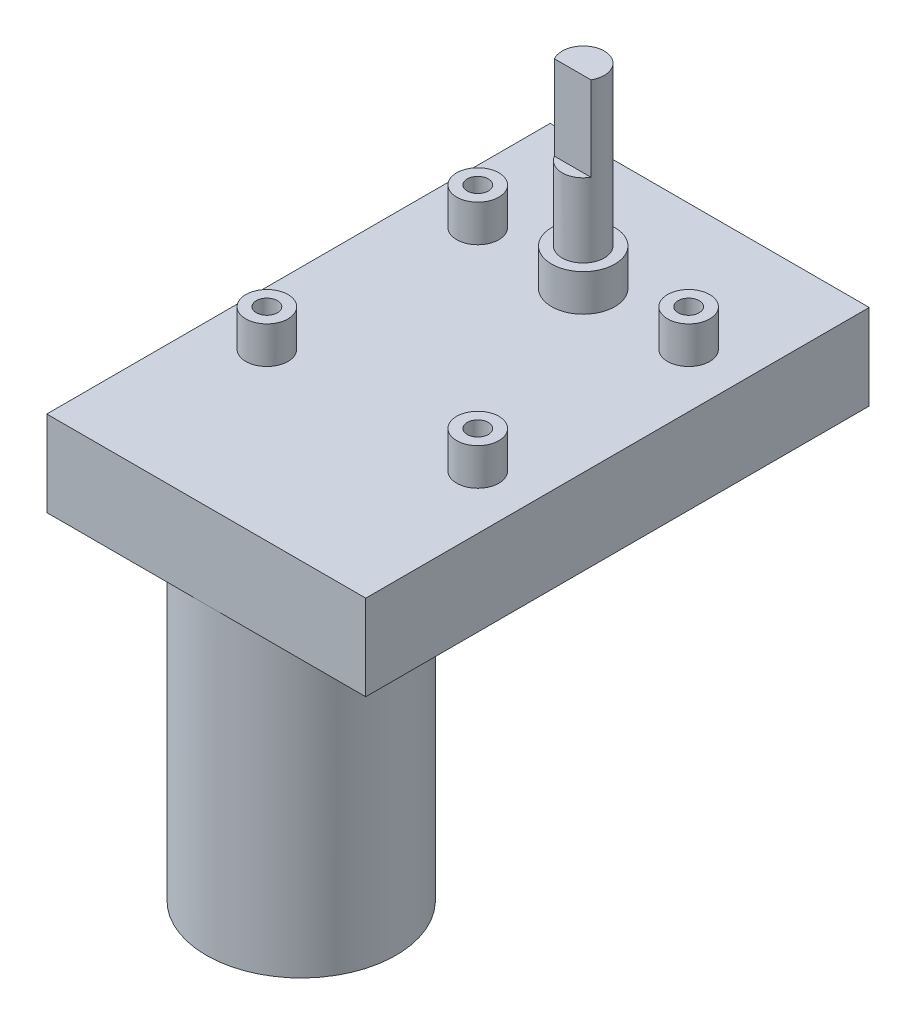
ISO-10303-21;
HEADER;
FILE_DESCRIPTION(('STEP AP214'),'2;1');
FILE_NAME('part.step','',(''),(''),'','','');
FILE_SCHEMA(('AUTOMOTIVE_DESIGN { 1 0 10303 214 1 1 1 1 }'));
ENDSEC;
DATA;
#1=APPLICATION_CONTEXT('core data for automotive mechanical design processes');
#2=APPLICATION_PROTOCOL_DEFINITION('international standard','automotive_design',2000,#1);
#3=PRODUCT_CONTEXT('',#1,'mechanical');
#4=PRODUCT('Part','Part','',(#3));
#5=PRODUCT_RELATED_PRODUCT_CATEGORY('part','',(#4));
#6=PRODUCT_DEFINITION_FORMATION('','',#4);
#7=PRODUCT_DEFINITION_CONTEXT('part definition',#1,'design');
#8=PRODUCT_DEFINITION('design','',#6,#7);
#9=PRODUCT_DEFINITION_SHAPE('','',#8);
#10=(LENGTH_UNIT() NAMED_UNIT(*) SI_UNIT(.MILLI.,.METRE.));
#11=(NAMED_UNIT(*) PLANE_ANGLE_UNIT() SI_UNIT($,.RADIAN.));
#12=(NAMED_UNIT(*) SI_UNIT($,.STERADIAN.) SOLID_ANGLE_UNIT());
#13=UNCERTAINTY_MEASURE_WITH_UNIT(LENGTH_MEASURE(1.E-05),#10,'distance_accuracy_value','');
#14=(GEOMETRIC_REPRESENTATION_CONTEXT(3) GLOBAL_UNCERTAINTY_ASSIGNED_CONTEXT((#13)) GLOBAL_UNIT_ASSIGNED_CONTEXT((#10,
#11,#12)) REPRESENTATION_CONTEXT('',''));
#15=CARTESIAN_POINT('',(0.,0.,0.));
#16=DIRECTION('',(0.,0.,1.));
#17=DIRECTION('',(1.,0.,0.));
#18=AXIS2_PLACEMENT_3D('',#15,#16,#17);
#19=CARTESIAN_POINT('',(-30.25,16.2,71.5));
#20=DIRECTION('',(-1.,0.,0.));
#21=DIRECTION('',(0.,0.,1.));
#22=AXIS2_PLACEMENT_3D('',#19,#20,#21);
#23=PLANE('',#22);
#24=DIRECTION('',(0.,0.,-1.));
#25=VECTOR('',#24,1.);
#26=CARTESIAN_POINT('',(-30.25,0.,71.5));
#27=LINE('',#26,#25);
#28=CARTESIAN_POINT('',(-30.25,0.,71.5));
#29=VERTEX_POINT('',#28);
#30=CARTESIAN_POINT('',(-30.25,0.,-24.));
#31=VERTEX_POINT('',#30);
#32=EDGE_CURVE('E178',#29,#31,#27,.T.);
#33=ORIENTED_EDGE('',*,*,#32,.F.);
#34=DIRECTION('',(0.,-1.,0.));
#35=VECTOR('',#34,1.);
#36=CARTESIAN_POINT('',(-30.25,16.2,71.5));
#37=LINE('',#36,#35);
#38=CARTESIAN_POINT('',(-30.25,16.2,71.5));
#39=VERTEX_POINT('',#38);
#40=EDGE_CURVE('E210',#39,#29,#37,.T.);
#41=ORIENTED_EDGE('',*,*,#40,.F.);
#42=DIRECTION('',(0.,0.,-1.));
#43=VECTOR('',#42,1.);
#44=CARTESIAN_POINT('',(-30.25,16.2,71.5));
#45=LINE('',#44,#43);
#46=CARTESIAN_POINT('',(-30.25,16.2,-24.));
#47=VERTEX_POINT('',#46);
#48=EDGE_CURVE('E179',#39,#47,#45,.T.);
#49=ORIENTED_EDGE('',*,*,#48,.T.);
#50=DIRECTION('',(0.,-1.,0.));
#51=VECTOR('',#50,1.);
#52=CARTESIAN_POINT('',(-30.25,16.2,-24.));
#53=LINE('',#52,#51);
#54=EDGE_CURVE('E194',#47,#31,#53,.T.);
#55=ORIENTED_EDGE('',*,*,#54,.T.);
#56=EDGE_LOOP('',(#33,#41,#49,#55));
#57=FACE_BOUND('',#56,.T.);
#58=ADVANCED_FACE('F39',(#57),#23,.T.);
#59=CARTESIAN_POINT('',(-30.25,16.2,71.5));
#60=DIRECTION('',(0.,0.,-1.));
#61=DIRECTION('',(-1.,0.,0.));
#62=AXIS2_PLACEMENT_3D('',#59,#60,#61);
#63=PLANE('',#62);
#64=DIRECTION('',(1.,0.,0.));
#65=VECTOR('',#64,1.);
#66=CARTESIAN_POINT('',(-30.25,0.,71.5));
#67=LINE('',#66,#65);
#68=CARTESIAN_POINT('',(0.,0.,71.5));
#69=VERTEX_POINT('',#68);
#70=EDGE_CURVE('E184',#29,#69,#67,.T.);
#71=ORIENTED_EDGE('',*,*,#70,.T.);
#72=CARTESIAN_POINT('',(30.25,0.,71.5));
#73=VERTEX_POINT('',#72);
#74=EDGE_CURVE('E206',#69,#73,#67,.T.);
#75=ORIENTED_EDGE('',*,*,#74,.T.);
#76=DIRECTION('',(0.,-1.,0.));
#77=VECTOR('',#76,1.);
#78=CARTESIAN_POINT('',(30.25,16.2,71.5));
#79=LINE('',#78,#77);
#80=CARTESIAN_POINT('',(30.25,16.2,71.5));
#81=VERTEX_POINT('',#80);
#82=EDGE_CURVE('E214',#81,#73,#79,.T.);
#83=ORIENTED_EDGE('',*,*,#82,.F.);
#84=DIRECTION('',(1.,0.,0.));
#85=VECTOR('',#84,1.);
#86=CARTESIAN_POINT('',(-30.25,16.2,71.5));
#87=LINE('',#86,#85);
#88=EDGE_CURVE('E191',#39,#81,#87,.T.);
#89=ORIENTED_EDGE('',*,*,#88,.F.);
#90=ORIENTED_EDGE('',*,*,#40,.T.);
#91=EDGE_LOOP('',(#71,#75,#83,#89,#90));
#92=FACE_BOUND('',#91,.T.);
#93=ADVANCED_FACE('F282',(#92),#63,.F.);
#94=CARTESIAN_POINT('',(30.25,16.2,71.5));
#95=DIRECTION('',(-1.,0.,0.));
#96=DIRECTION('',(0.,0.,1.));
#97=AXIS2_PLACEMENT_3D('',#94,#95,#96);
#98=PLANE('',#97);
#99=DIRECTION('',(0.,0.,-1.));
#100=VECTOR('',#99,1.);
#101=CARTESIAN_POINT('',(30.25,0.,71.5));
#102=LINE('',#101,#100);
#103=CARTESIAN_POINT('',(30.25,0.,-24.));
#104=VERTEX_POINT('',#103);
#105=EDGE_CURVE('E202',#73,#104,#102,.T.);
#106=ORIENTED_EDGE('',*,*,#105,.T.);
#107=DIRECTION('',(0.,-1.,0.));
#108=VECTOR('',#107,1.);
#109=CARTESIAN_POINT('',(30.25,16.2,-24.));
#110=LINE('',#109,#108);
#111=CARTESIAN_POINT('',(30.25,16.2,-24.));
#112=VERTEX_POINT('',#111);
#113=EDGE_CURVE('E218',#112,#104,#110,.T.);
#114=ORIENTED_EDGE('',*,*,#113,.F.);
#115=DIRECTION('',(0.,0.,-1.));
#116=VECTOR('',#115,1.);
#117=CARTESIAN_POINT('',(30.25,16.2,71.5));
#118=LINE('',#117,#116);
#119=EDGE_CURVE('E188',#81,#112,#118,.T.);
#120=ORIENTED_EDGE('',*,*,#119,.F.);
#121=ORIENTED_EDGE('',*,*,#82,.T.);
#122=EDGE_LOOP('',(#106,#114,#120,#121));
#123=FACE_BOUND('',#122,.T.);
#124=ADVANCED_FACE('F287',(#123),#98,.F.);
#125=CARTESIAN_POINT('',(-30.25,16.2,-24.));
#126=DIRECTION('',(0.,0.,-1.));
#127=DIRECTION('',(-1.,0.,0.));
#128=AXIS2_PLACEMENT_3D('',#125,#126,#127);
#129=PLANE('',#128);
#130=DIRECTION('',(1.,0.,0.));
#131=VECTOR('',#130,1.);
#132=CARTESIAN_POINT('',(-30.25,0.,-24.));
#133=LINE('',#132,#131);
#134=EDGE_CURVE('E198',#31,#104,#133,.T.);
#135=ORIENTED_EDGE('',*,*,#134,.F.);
#136=ORIENTED_EDGE('',*,*,#54,.F.);
#137=DIRECTION('',(1.,0.,0.));
#138=VECTOR('',#137,1.);
#139=CARTESIAN_POINT('',(-30.25,16.2,-24.));
#140=LINE('',#139,#138);
#141=EDGE_CURVE('E183',#47,#112,#140,.T.);
#142=ORIENTED_EDGE('',*,*,#141,.T.);
#143=ORIENTED_EDGE('',*,*,#113,.T.);
#144=EDGE_LOOP('',(#135,#136,#142,#143));
#145=FACE_BOUND('',#144,.T.);
#146=ADVANCED_FACE('F304',(#145),#129,.T.);
#147=CARTESIAN_POINT('',(0.,16.2,0.));
#148=DIRECTION('',(0.,-1.,0.));
#149=DIRECTION('',(0.,0.,-1.));
#150=AXIS2_PLACEMENT_3D('',#147,#148,#149);
#151=PLANE('',#150);
#152=CARTESIAN_POINT('',(-20.,16.2,40.));
#153=DIRECTION('',(0.,-1.,0.));
#154=DIRECTION('',(0.,0.,-1.));
#155=AXIS2_PLACEMENT_3D('',#152,#153,#154);
#156=CIRCLE('',#155,4.);
#157=CARTESIAN_POINT('',(-20.,16.2,36.));
#158=VERTEX_POINT('',#157);
#159=EDGE_CURVE('E126',#158,#158,#156,.F.);
#160=ORIENTED_EDGE('',*,*,#159,.F.);
#161=EDGE_LOOP('',(#160));
#162=FACE_BOUND('',#161,.T.);
#163=CARTESIAN_POINT('',(20.,16.2,40.));
#164=DIRECTION('',(0.,-1.,0.));
#165=DIRECTION('',(0.,0.,-1.));
#166=AXIS2_PLACEMENT_3D('',#163,#164,#165);
#167=CIRCLE('',#166,4.);
#168=CARTESIAN_POINT('',(20.,16.2,36.));
#169=VERTEX_POINT('',#168);
#170=EDGE_CURVE('E234',#169,#169,#167,.F.);
#171=ORIENTED_EDGE('',*,*,#170,.F.);
#172=EDGE_LOOP('',(#171));
#173=FACE_BOUND('',#172,.T.);
#174=CARTESIAN_POINT('',(20.,16.2,0.));
#175=DIRECTION('',(0.,-1.,0.));
#176=DIRECTION('',(0.,0.,-1.));
#177=AXIS2_PLACEMENT_3D('',#174,#175,#176);
#178=CIRCLE('',#177,4.);
#179=CARTESIAN_POINT('',(20.,16.2,-4.));
#180=VERTEX_POINT('',#179);
#181=EDGE_CURVE('E230',#180,#180,#178,.F.);
#182=ORIENTED_EDGE('',*,*,#181,.F.);
#183=EDGE_LOOP('',(#182));
#184=FACE_BOUND('',#183,.T.);
#185=CARTESIAN_POINT('',(-20.,16.2,0.));
#186=DIRECTION('',(0.,-1.,0.));
#187=DIRECTION('',(0.,0.,-1.));
#188=AXIS2_PLACEMENT_3D('',#185,#186,#187);
#189=CIRCLE('',#188,4.);
#190=CARTESIAN_POINT('',(-20.,16.2,-4.));
#191=VERTEX_POINT('',#190);
#192=EDGE_CURVE('E226',#191,#191,#189,.F.);
#193=ORIENTED_EDGE('',*,*,#192,.F.);
#194=EDGE_LOOP('',(#193));
#195=FACE_BOUND('',#194,.T.);
#196=CARTESIAN_POINT('',(0.,16.2,0.));
#197=DIRECTION('',(0.,-1.,0.));
#198=DIRECTION('',(0.,0.,-1.));
#199=AXIS2_PLACEMENT_3D('',#196,#197,#198);
#200=CIRCLE('',#199,6.);
#201=CARTESIAN_POINT('',(0.,16.2,-6.));
#202=VERTEX_POINT('',#201);
#203=EDGE_CURVE('E213',#202,#202,#200,.F.);
#204=ORIENTED_EDGE('',*,*,#203,.F.);
#205=EDGE_LOOP('',(#204));
#206=FACE_BOUND('',#205,.T.);
#207=ORIENTED_EDGE('',*,*,#48,.F.);
#208=ORIENTED_EDGE('',*,*,#88,.T.);
#209=ORIENTED_EDGE('',*,*,#119,.T.);
#210=ORIENTED_EDGE('',*,*,#141,.F.);
#211=EDGE_LOOP('',(#207,#208,#209,#210));
#212=FACE_BOUND('',#211,.T.);
#213=ADVANCED_FACE('F301',(#162,#173,#184,#195,#206,#212),#151,.F.);
#214=CARTESIAN_POINT('',(0.,0.,0.));
#215=DIRECTION('',(0.,-1.,0.));
#216=DIRECTION('',(0.,0.,-1.));
#217=AXIS2_PLACEMENT_3D('',#214,#215,#216);
#218=PLANE('',#217);
#219=CARTESIAN_POINT('',(17.5,0.,12.5));
#220=DIRECTION('',(0.,-1.,0.));
#221=DIRECTION('',(0.,0.,-1.));
#222=AXIS2_PLACEMENT_3D('',#219,#220,#221);
#223=CIRCLE('',#222,4.);
#224=CARTESIAN_POINT('',(17.5,0.,8.5));
#225=VERTEX_POINT('',#224);
#226=EDGE_CURVE('E677',#225,#225,#223,.T.);
#227=ORIENTED_EDGE('',*,*,#226,.F.);
#228=EDGE_LOOP('',(#227));
#229=FACE_BOUND('',#228,.T.);
#230=CARTESIAN_POINT('',(-17.5,0.,12.5));
#231=DIRECTION('',(0.,-1.,0.));
#232=DIRECTION('',(0.,0.,-1.));
#233=AXIS2_PLACEMENT_3D('',#230,#231,#232);
#234=CIRCLE('',#233,4.);
#235=CARTESIAN_POINT('',(-17.5,0.,8.5));
#236=VERTEX_POINT('',#235);
#237=EDGE_CURVE('E692',#236,#236,#234,.T.);
#238=ORIENTED_EDGE('',*,*,#237,.F.);
#239=EDGE_LOOP('',(#238));
#240=FACE_BOUND('',#239,.T.);
#241=CARTESIAN_POINT('',(-17.5,0.,-12.5));
#242=DIRECTION('',(0.,-1.,0.));
#243=DIRECTION('',(0.,0.,-1.));
#244=AXIS2_PLACEMENT_3D('',#241,#242,#243);
#245=CIRCLE('',#244,4.);
#246=CARTESIAN_POINT('',(-17.5,0.,-16.5));
#247=VERTEX_POINT('',#246);
#248=EDGE_CURVE('E704',#247,#247,#245,.T.);
#249=ORIENTED_EDGE('',*,*,#248,.F.);
#250=EDGE_LOOP('',(#249));
#251=FACE_BOUND('',#250,.T.);
#252=CARTESIAN_POINT('',(17.5,0.,-12.5));
#253=DIRECTION('',(0.,-1.,0.));
#254=DIRECTION('',(0.,0.,-1.));
#255=AXIS2_PLACEMENT_3D('',#252,#253,#254);
#256=CIRCLE('',#255,4.);
#257=CARTESIAN_POINT('',(17.5,0.,-16.5));
#258=VERTEX_POINT('',#257);
#259=EDGE_CURVE('E716',#258,#258,#256,.T.);
#260=ORIENTED_EDGE('',*,*,#259,.F.);
#261=EDGE_LOOP('',(#260));
#262=FACE_BOUND('',#261,.T.);
#263=ORIENTED_EDGE('',*,*,#74,.F.);
#264=CARTESIAN_POINT('',(0.,0.,53.5));
#265=DIRECTION('',(0.,-1.,0.));
#266=DIRECTION('',(0.,0.,-1.));
#267=AXIS2_PLACEMENT_3D('',#264,#265,#266);
#268=CIRCLE('',#267,18.);
#269=EDGE_CURVE('E52',#69,#69,#268,.T.);
#270=ORIENTED_EDGE('',*,*,#269,.F.);
#271=ORIENTED_EDGE('',*,*,#70,.F.);
#272=ORIENTED_EDGE('',*,*,#32,.T.);
#273=ORIENTED_EDGE('',*,*,#134,.T.);
#274=ORIENTED_EDGE('',*,*,#105,.F.);
#275=EDGE_LOOP('',(#263,#270,#271,#272,#273,#274));
#276=FACE_BOUND('',#275,.T.);
#277=ADVANCED_FACE('F269',(#229,#240,#251,#262,#276),#218,.T.);
#278=CARTESIAN_POINT('',(0.,23.2,0.));
#279=DIRECTION('',(0.,-1.,0.));
#280=DIRECTION('',(0.,0.,-1.));
#281=AXIS2_PLACEMENT_3D('',#278,#279,#280);
#282=CYLINDRICAL_SURFACE('',#281,6.);
#283=CARTESIAN_POINT('',(0.,23.2,0.));
#284=DIRECTION('',(0.,1.,0.));
#285=DIRECTION('',(0.,0.,1.));
#286=AXIS2_PLACEMENT_3D('',#283,#284,#285);
#287=CIRCLE('',#286,6.);
#288=CARTESIAN_POINT('',(0.,23.2,6.));
#289=VERTEX_POINT('',#288);
#290=EDGE_CURVE('E174',#289,#289,#287,.T.);
#291=ORIENTED_EDGE('',*,*,#290,.F.);
#292=EDGE_LOOP('',(#291));
#293=FACE_BOUND('',#292,.T.);
#294=ORIENTED_EDGE('',*,*,#203,.T.);
#295=EDGE_LOOP('',(#294));
#296=FACE_BOUND('',#295,.T.);
#297=ADVANCED_FACE('F321',(#293,#296),#282,.T.);
#298=CARTESIAN_POINT('',(0.,23.2,0.));
#299=DIRECTION('',(0.,1.,0.));
#300=DIRECTION('',(0.,0.,1.));
#301=AXIS2_PLACEMENT_3D('',#298,#299,#300);
#302=PLANE('',#301);
#303=CARTESIAN_POINT('',(0.,23.2,0.));
#304=DIRECTION('',(0.,1.,0.));
#305=DIRECTION('',(0.,0.,1.));
#306=AXIS2_PLACEMENT_3D('',#303,#304,#305);
#307=CIRCLE('',#306,4.);
#308=CARTESIAN_POINT('',(0.,23.2,4.));
#309=VERTEX_POINT('',#308);
#310=EDGE_CURVE('E121',#309,#309,#307,.T.);
#311=ORIENTED_EDGE('',*,*,#310,.F.);
#312=EDGE_LOOP('',(#311));
#313=FACE_BOUND('',#312,.T.);
#314=ORIENTED_EDGE('',*,*,#290,.T.);
#315=EDGE_LOOP('',(#314));
#316=FACE_BOUND('',#315,.T.);
#317=ADVANCED_FACE('F386',(#313,#316),#302,.T.);
#318=CARTESIAN_POINT('',(-20.,23.2,0.));
#319=DIRECTION('',(0.,1.,0.));
#320=DIRECTION('',(0.,0.,1.));
#321=AXIS2_PLACEMENT_3D('',#318,#319,#320);
#322=PLANE('',#321);
#323=CARTESIAN_POINT('',(-20.,23.2,0.));
#324=DIRECTION('',(0.,1.,0.));
#325=DIRECTION('',(0.,0.,1.));
#326=AXIS2_PLACEMENT_3D('',#323,#324,#325);
#327=CIRCLE('',#326,4.);
#328=CARTESIAN_POINT('',(-20.,23.2,4.));
#329=VERTEX_POINT('',#328);
#330=EDGE_CURVE('E167',#329,#329,#327,.T.);
#331=ORIENTED_EDGE('',*,*,#330,.T.);
#332=EDGE_LOOP('',(#331));
#333=FACE_BOUND('',#332,.T.);
#334=CARTESIAN_POINT('',(-20.,23.2,0.));
#335=DIRECTION('',(0.,1.,0.));
#336=DIRECTION('',(0.,0.,1.));
#337=AXIS2_PLACEMENT_3D('',#334,#335,#336);
#338=CIRCLE('',#337,2.);
#339=CARTESIAN_POINT('',(-20.,23.2,2.));
#340=VERTEX_POINT('',#339);
#341=EDGE_CURVE('E163',#340,#340,#338,.T.);
#342=ORIENTED_EDGE('',*,*,#341,.F.);
#343=EDGE_LOOP('',(#342));
#344=FACE_BOUND('',#343,.T.);
#345=ADVANCED_FACE('F383',(#333,#344),#322,.T.);
#346=CARTESIAN_POINT('',(-20.,23.2,0.));
#347=DIRECTION('',(0.,-1.,0.));
#348=DIRECTION('',(0.,0.,-1.));
#349=AXIS2_PLACEMENT_3D('',#346,#347,#348);
#350=CYLINDRICAL_SURFACE('',#349,4.);
#351=ORIENTED_EDGE('',*,*,#330,.F.);
#352=EDGE_LOOP('',(#351));
#353=FACE_BOUND('',#352,.T.);
#354=ORIENTED_EDGE('',*,*,#192,.T.);
#355=EDGE_LOOP('',(#354));
#356=FACE_BOUND('',#355,.T.);
#357=ADVANCED_FACE('F342',(#353,#356),#350,.T.);
#358=CARTESIAN_POINT('',(-20.,23.2,0.));
#359=DIRECTION('',(0.,-1.,0.));
#360=DIRECTION('',(0.,0.,-1.));
#361=AXIS2_PLACEMENT_3D('',#358,#359,#360);
#362=CYLINDRICAL_SURFACE('',#361,2.);
#363=ORIENTED_EDGE('',*,*,#341,.T.);
#364=EDGE_LOOP('',(#363));
#365=FACE_BOUND('',#364,.T.);
#366=CARTESIAN_POINT('',(-20.,16.2,0.));
#367=DIRECTION('',(0.,1.,0.));
#368=DIRECTION('',(0.,0.,1.));
#369=AXIS2_PLACEMENT_3D('',#366,#367,#368);
#370=CIRCLE('',#369,2.);
#371=CARTESIAN_POINT('',(-20.,16.2,2.));
#372=VERTEX_POINT('',#371);
#373=EDGE_CURVE('E162',#372,#372,#370,.T.);
#374=ORIENTED_EDGE('',*,*,#373,.F.);
#375=EDGE_LOOP('',(#374));
#376=FACE_BOUND('',#375,.T.);
#377=ADVANCED_FACE('F332',(#365,#376),#362,.F.);
#378=ORIENTED_EDGE('',*,*,#373,.T.);
#379=EDGE_LOOP('',(#378));
#380=FACE_BOUND('',#379,.T.);
#381=ADVANCED_FACE('F317',(#380),#151,.F.);
#382=CARTESIAN_POINT('',(20.,23.2,0.));
#383=DIRECTION('',(0.,1.,0.));
#384=DIRECTION('',(0.,0.,1.));
#385=AXIS2_PLACEMENT_3D('',#382,#383,#384);
#386=PLANE('',#385);
#387=CARTESIAN_POINT('',(20.,23.2,0.));
#388=DIRECTION('',(0.,1.,0.));
#389=DIRECTION('',(0.,0.,1.));
#390=AXIS2_PLACEMENT_3D('',#387,#388,#389);
#391=CIRCLE('',#390,4.);
#392=CARTESIAN_POINT('',(20.,23.2,4.));
#393=VERTEX_POINT('',#392);
#394=EDGE_CURVE('E155',#393,#393,#391,.T.);
#395=ORIENTED_EDGE('',*,*,#394,.T.);
#396=EDGE_LOOP('',(#395));
#397=FACE_BOUND('',#396,.T.);
#398=CARTESIAN_POINT('',(20.,23.2,0.));
#399=DIRECTION('',(0.,1.,0.));
#400=DIRECTION('',(0.,0.,1.));
#401=AXIS2_PLACEMENT_3D('',#398,#399,#400);
#402=CIRCLE('',#401,2.);
#403=CARTESIAN_POINT('',(20.,23.2,2.));
#404=VERTEX_POINT('',#403);
#405=EDGE_CURVE('E151',#404,#404,#402,.T.);
#406=ORIENTED_EDGE('',*,*,#405,.F.);
#407=EDGE_LOOP('',(#406));
#408=FACE_BOUND('',#407,.T.);
#409=ADVANCED_FACE('F331',(#397,#408),#386,.T.);
#410=CARTESIAN_POINT('',(20.,23.2,0.));
#411=DIRECTION('',(0.,-1.,0.));
#412=DIRECTION('',(0.,0.,-1.));
#413=AXIS2_PLACEMENT_3D('',#410,#411,#412);
#414=CYLINDRICAL_SURFACE('',#413,4.);
#415=ORIENTED_EDGE('',*,*,#394,.F.);
#416=EDGE_LOOP('',(#415));
#417=FACE_BOUND('',#416,.T.);
#418=ORIENTED_EDGE('',*,*,#181,.T.);
#419=EDGE_LOOP('',(#418));
#420=FACE_BOUND('',#419,.T.);
#421=ADVANCED_FACE('F339',(#417,#420),#414,.T.);
#422=CARTESIAN_POINT('',(20.,23.2,0.));
#423=DIRECTION('',(0.,-1.,0.));
#424=DIRECTION('',(0.,0.,-1.));
#425=AXIS2_PLACEMENT_3D('',#422,#423,#424);
#426=CYLINDRICAL_SURFACE('',#425,2.);
#427=ORIENTED_EDGE('',*,*,#405,.T.);
#428=EDGE_LOOP('',(#427));
#429=FACE_BOUND('',#428,.T.);
#430=CARTESIAN_POINT('',(20.,16.2,0.));
#431=DIRECTION('',(0.,1.,0.));
#432=DIRECTION('',(0.,0.,1.));
#433=AXIS2_PLACEMENT_3D('',#430,#431,#432);
#434=CIRCLE('',#433,2.);
#435=CARTESIAN_POINT('',(20.,16.2,2.));
#436=VERTEX_POINT('',#435);
#437=EDGE_CURVE('E150',#436,#436,#434,.T.);
#438=ORIENTED_EDGE('',*,*,#437,.F.);
#439=EDGE_LOOP('',(#438));
#440=FACE_BOUND('',#439,.T.);
#441=ADVANCED_FACE('F347',(#429,#440),#426,.F.);
#442=ORIENTED_EDGE('',*,*,#437,.T.);
#443=EDGE_LOOP('',(#442));
#444=FACE_BOUND('',#443,.T.);
#445=ADVANCED_FACE('F334',(#444),#151,.F.);
#446=CARTESIAN_POINT('',(20.,23.2,40.));
#447=DIRECTION('',(0.,1.,0.));
#448=DIRECTION('',(0.,0.,1.));
#449=AXIS2_PLACEMENT_3D('',#446,#447,#448);
#450=PLANE('',#449);
#451=CARTESIAN_POINT('',(20.,23.2,40.));
#452=DIRECTION('',(0.,1.,0.));
#453=DIRECTION('',(0.,0.,1.));
#454=AXIS2_PLACEMENT_3D('',#451,#452,#453);
#455=CIRCLE('',#454,4.);
#456=CARTESIAN_POINT('',(20.,23.2,44.));
#457=VERTEX_POINT('',#456);
#458=EDGE_CURVE('E143',#457,#457,#455,.T.);
#459=ORIENTED_EDGE('',*,*,#458,.T.);
#460=EDGE_LOOP('',(#459));
#461=FACE_BOUND('',#460,.T.);
#462=CARTESIAN_POINT('',(20.,23.2,40.));
#463=DIRECTION('',(0.,1.,0.));
#464=DIRECTION('',(0.,0.,1.));
#465=AXIS2_PLACEMENT_3D('',#462,#463,#464);
#466=CIRCLE('',#465,2.);
#467=CARTESIAN_POINT('',(20.,23.2,42.));
#468=VERTEX_POINT('',#467);
#469=EDGE_CURVE('E139',#468,#468,#466,.T.);
#470=ORIENTED_EDGE('',*,*,#469,.F.);
#471=EDGE_LOOP('',(#470));
#472=FACE_BOUND('',#471,.T.);
#473=ADVANCED_FACE('F346',(#461,#472),#450,.T.);
#474=CARTESIAN_POINT('',(20.,23.2,40.));
#475=DIRECTION('',(0.,-1.,0.));
#476=DIRECTION('',(0.,0.,-1.));
#477=AXIS2_PLACEMENT_3D('',#474,#475,#476);
#478=CYLINDRICAL_SURFACE('',#477,4.);
#479=ORIENTED_EDGE('',*,*,#458,.F.);
#480=EDGE_LOOP('',(#479));
#481=FACE_BOUND('',#480,.T.);
#482=ORIENTED_EDGE('',*,*,#170,.T.);
#483=EDGE_LOOP('',(#482));
#484=FACE_BOUND('',#483,.T.);
#485=ADVANCED_FACE('F353',(#481,#484),#478,.T.);
#486=CARTESIAN_POINT('',(20.,23.2,40.));
#487=DIRECTION('',(0.,-1.,0.));
#488=DIRECTION('',(0.,0.,-1.));
#489=AXIS2_PLACEMENT_3D('',#486,#487,#488);
#490=CYLINDRICAL_SURFACE('',#489,2.);
#491=ORIENTED_EDGE('',*,*,#469,.T.);
#492=EDGE_LOOP('',(#491));
#493=FACE_BOUND('',#492,.T.);
#494=CARTESIAN_POINT('',(20.,16.2,40.));
#495=DIRECTION('',(0.,1.,0.));
#496=DIRECTION('',(0.,0.,1.));
#497=AXIS2_PLACEMENT_3D('',#494,#495,#496);
#498=CIRCLE('',#497,2.);
#499=CARTESIAN_POINT('',(20.,16.2,42.));
#500=VERTEX_POINT('',#499);
#501=EDGE_CURVE('E138',#500,#500,#498,.T.);
#502=ORIENTED_EDGE('',*,*,#501,.F.);
#503=EDGE_LOOP('',(#502));
#504=FACE_BOUND('',#503,.T.);
#505=ADVANCED_FACE('F360',(#493,#504),#490,.F.);
#506=ORIENTED_EDGE('',*,*,#501,.T.);
#507=EDGE_LOOP('',(#506));
#508=FACE_BOUND('',#507,.T.);
#509=ADVANCED_FACE('F329',(#508),#151,.F.);
#510=CARTESIAN_POINT('',(-20.,23.2,40.));
#511=DIRECTION('',(0.,1.,0.));
#512=DIRECTION('',(0.,0.,1.));
#513=AXIS2_PLACEMENT_3D('',#510,#511,#512);
#514=PLANE('',#513);
#515=CARTESIAN_POINT('',(-20.,23.2,40.));
#516=DIRECTION('',(0.,1.,0.));
#517=DIRECTION('',(0.,0.,1.));
#518=AXIS2_PLACEMENT_3D('',#515,#516,#517);
#519=CIRCLE('',#518,4.);
#520=CARTESIAN_POINT('',(-20.,23.2,44.));
#521=VERTEX_POINT('',#520);
#522=EDGE_CURVE('E131',#521,#521,#519,.T.);
#523=ORIENTED_EDGE('',*,*,#522,.T.);
#524=EDGE_LOOP('',(#523));
#525=FACE_BOUND('',#524,.T.);
#526=CARTESIAN_POINT('',(-20.,23.2,40.));
#527=DIRECTION('',(0.,1.,0.));
#528=DIRECTION('',(0.,0.,1.));
#529=AXIS2_PLACEMENT_3D('',#526,#527,#528);
#530=CIRCLE('',#529,2.);
#531=CARTESIAN_POINT('',(-20.,23.2,42.));
#532=VERTEX_POINT('',#531);
#533=EDGE_CURVE('E127',#532,#532,#530,.T.);
#534=ORIENTED_EDGE('',*,*,#533,.F.);
#535=EDGE_LOOP('',(#534));
#536=FACE_BOUND('',#535,.T.);
#537=ADVANCED_FACE('F359',(#525,#536),#514,.T.);
#538=CARTESIAN_POINT('',(-20.,23.2,40.));
#539=DIRECTION('',(0.,-1.,0.));
#540=DIRECTION('',(0.,0.,-1.));
#541=AXIS2_PLACEMENT_3D('',#538,#539,#540);
#542=CYLINDRICAL_SURFACE('',#541,4.);
#543=ORIENTED_EDGE('',*,*,#522,.F.);
#544=EDGE_LOOP('',(#543));
#545=FACE_BOUND('',#544,.T.);
#546=ORIENTED_EDGE('',*,*,#159,.T.);
#547=EDGE_LOOP('',(#546));
#548=FACE_BOUND('',#547,.T.);
#549=ADVANCED_FACE('F366',(#545,#548),#542,.T.);
#550=CARTESIAN_POINT('',(-20.,23.2,40.));
#551=DIRECTION('',(0.,-1.,0.));
#552=DIRECTION('',(0.,0.,-1.));
#553=AXIS2_PLACEMENT_3D('',#550,#551,#552);
#554=CYLINDRICAL_SURFACE('',#553,2.);
#555=ORIENTED_EDGE('',*,*,#533,.T.);
#556=EDGE_LOOP('',(#555));
#557=FACE_BOUND('',#556,.T.);
#558=CARTESIAN_POINT('',(-20.,16.2,40.));
#559=DIRECTION('',(0.,1.,0.));
#560=DIRECTION('',(0.,0.,1.));
#561=AXIS2_PLACEMENT_3D('',#558,#559,#560);
#562=CIRCLE('',#561,2.);
#563=CARTESIAN_POINT('',(-20.,16.2,42.));
#564=VERTEX_POINT('',#563);
#565=EDGE_CURVE('E120',#564,#564,#562,.T.);
#566=ORIENTED_EDGE('',*,*,#565,.F.);
#567=EDGE_LOOP('',(#566));
#568=FACE_BOUND('',#567,.T.);
#569=ADVANCED_FACE('F327',(#557,#568),#554,.F.);
#570=ORIENTED_EDGE('',*,*,#565,.T.);
#571=EDGE_LOOP('',(#570));
#572=FACE_BOUND('',#571,.T.);
#573=ADVANCED_FACE('F316',(#572),#151,.F.);
#574=CARTESIAN_POINT('',(0.,53.2,0.));
#575=DIRECTION('',(0.,-1.,0.));
#576=DIRECTION('',(0.,0.,-1.));
#577=AXIS2_PLACEMENT_3D('',#574,#575,#576);
#578=CYLINDRICAL_SURFACE('',#577,4.);
#579=CARTESIAN_POINT('',(0.,53.2,0.));
#580=DIRECTION('',(0.,1.,0.));
#581=DIRECTION('',(0.,0.,1.));
#582=AXIS2_PLACEMENT_3D('',#579,#580,#581);
#583=CIRCLE('',#582,4.);
#584=CARTESIAN_POINT('',(3.46410161513775,53.2,2.));
#585=VERTEX_POINT('',#584);
#586=CARTESIAN_POINT('',(-3.46410161513775,53.2,2.));
#587=VERTEX_POINT('',#586);
#588=EDGE_CURVE('E111',#585,#587,#583,.T.);
#589=ORIENTED_EDGE('',*,*,#588,.F.);
#590=DIRECTION('',(0.,1.,0.));
#591=VECTOR('',#590,1.);
#592=CARTESIAN_POINT('',(3.46410161513775,37.2,2.));
#593=LINE('',#592,#591);
#594=CARTESIAN_POINT('',(3.46410161513775,37.2,2.));
#595=VERTEX_POINT('',#594);
#596=EDGE_CURVE('E59',#595,#585,#593,.T.);
#597=ORIENTED_EDGE('',*,*,#596,.F.);
#598=CARTESIAN_POINT('',(0.,37.2,0.));
#599=DIRECTION('',(0.,1.,0.));
#600=DIRECTION('',(0.,0.,1.));
#601=AXIS2_PLACEMENT_3D('',#598,#599,#600);
#602=CIRCLE('',#601,4.);
#603=CARTESIAN_POINT('',(-3.46410161513775,37.2,2.));
#604=VERTEX_POINT('',#603);
#605=EDGE_CURVE('E95',#604,#595,#602,.T.);
#606=ORIENTED_EDGE('',*,*,#605,.F.);
#607=DIRECTION('',(0.,1.,0.));
#608=VECTOR('',#607,1.);
#609=CARTESIAN_POINT('',(-3.46410161513775,37.2,2.));
#610=LINE('',#609,#608);
#611=EDGE_CURVE('E104',#604,#587,#610,.T.);
#612=ORIENTED_EDGE('',*,*,#611,.T.);
#613=EDGE_LOOP('',(#589,#597,#606,#612));
#614=FACE_BOUND('',#613,.T.);
#615=ORIENTED_EDGE('',*,*,#310,.T.);
#616=EDGE_LOOP('',(#615));
#617=FACE_BOUND('',#616,.T.);
#618=ADVANCED_FACE('F108',(#614,#617),#578,.T.);
#619=CARTESIAN_POINT('',(0.,53.2,0.));
#620=DIRECTION('',(0.,1.,0.));
#621=DIRECTION('',(0.,0.,1.));
#622=AXIS2_PLACEMENT_3D('',#619,#620,#621);
#623=PLANE('',#622);
#624=DIRECTION('',(-1.,0.,0.));
#625=VECTOR('',#624,1.);
#626=CARTESIAN_POINT('',(-3.46410161513775,53.2,2.));
#627=LINE('',#626,#625);
#628=EDGE_CURVE('E101',#585,#587,#627,.T.);
#629=ORIENTED_EDGE('',*,*,#628,.F.);
#630=ORIENTED_EDGE('',*,*,#588,.T.);
#631=EDGE_LOOP('',(#629,#630));
#632=FACE_BOUND('',#631,.T.);
#633=ADVANCED_FACE('F505',(#632),#623,.T.);
#634=CARTESIAN_POINT('',(-3.46410161513775,37.2,2.));
#635=DIRECTION('',(0.,0.,-1.));
#636=DIRECTION('',(-1.,0.,0.));
#637=AXIS2_PLACEMENT_3D('',#634,#635,#636);
#638=PLANE('',#637);
#639=ORIENTED_EDGE('',*,*,#628,.T.);
#640=ORIENTED_EDGE('',*,*,#611,.F.);
#641=DIRECTION('',(-1.,0.,0.));
#642=VECTOR('',#641,1.);
#643=CARTESIAN_POINT('',(-3.46410161513775,37.2,2.));
#644=LINE('',#643,#642);
#645=EDGE_CURVE('E97',#595,#604,#644,.T.);
#646=ORIENTED_EDGE('',*,*,#645,.F.);
#647=ORIENTED_EDGE('',*,*,#596,.T.);
#648=EDGE_LOOP('',(#639,#640,#646,#647));
#649=FACE_BOUND('',#648,.T.);
#650=ADVANCED_FACE('F103',(#649),#638,.F.);
#651=CARTESIAN_POINT('',(0.,37.2,0.));
#652=DIRECTION('',(0.,1.,0.));
#653=DIRECTION('',(0.,0.,1.));
#654=AXIS2_PLACEMENT_3D('',#651,#652,#653);
#655=PLANE('',#654);
#656=ORIENTED_EDGE('',*,*,#605,.T.);
#657=ORIENTED_EDGE('',*,*,#645,.T.);
#658=EDGE_LOOP('',(#656,#657));
#659=FACE_BOUND('',#658,.T.);
#660=ADVANCED_FACE('F96',(#659),#655,.T.);
#661=CARTESIAN_POINT('',(17.5,-8.,-12.5));
#662=DIRECTION('',(0.,-1.,0.));
#663=DIRECTION('',(0.,0.,-1.));
#664=AXIS2_PLACEMENT_3D('',#661,#662,#663);
#665=PLANE('',#664);
#666=CARTESIAN_POINT('',(17.5,-8.,-12.5));
#667=DIRECTION('',(0.,-1.,0.));
#668=DIRECTION('',(0.,0.,-1.));
#669=AXIS2_PLACEMENT_3D('',#666,#667,#668);
#670=CIRCLE('',#669,4.);
#671=CARTESIAN_POINT('',(17.5,-8.,-16.5));
#672=VERTEX_POINT('',#671);
#673=EDGE_CURVE('E717',#672,#672,#670,.T.);
#674=ORIENTED_EDGE('',*,*,#673,.T.);
#675=EDGE_LOOP('',(#674));
#676=FACE_BOUND('',#675,.T.);
#677=CARTESIAN_POINT('',(17.5,-8.,-12.5));
#678=DIRECTION('',(0.,-1.,0.));
#679=DIRECTION('',(0.,0.,-1.));
#680=AXIS2_PLACEMENT_3D('',#677,#678,#679);
#681=CIRCLE('',#680,2.);
#682=CARTESIAN_POINT('',(17.5,-8.,-14.5));
#683=VERTEX_POINT('',#682);
#684=EDGE_CURVE('E709',#683,#683,#681,.T.);
#685=ORIENTED_EDGE('',*,*,#684,.F.);
#686=EDGE_LOOP('',(#685));
#687=FACE_BOUND('',#686,.T.);
#688=ADVANCED_FACE('F524',(#676,#687),#665,.T.);
#689=CARTESIAN_POINT('',(17.5,-8.,-12.5));
#690=DIRECTION('',(0.,1.,0.));
#691=DIRECTION('',(0.,0.,1.));
#692=AXIS2_PLACEMENT_3D('',#689,#690,#691);
#693=CYLINDRICAL_SURFACE('',#692,4.);
#694=ORIENTED_EDGE('',*,*,#673,.F.);
#695=EDGE_LOOP('',(#694));
#696=FACE_BOUND('',#695,.T.);
#697=ORIENTED_EDGE('',*,*,#259,.T.);
#698=EDGE_LOOP('',(#697));
#699=FACE_BOUND('',#698,.T.);
#700=ADVANCED_FACE('F531',(#696,#699),#693,.T.);
#701=CARTESIAN_POINT('',(17.5,-8.,-12.5));
#702=DIRECTION('',(0.,1.,0.));
#703=DIRECTION('',(0.,0.,1.));
#704=AXIS2_PLACEMENT_3D('',#701,#702,#703);
#705=CYLINDRICAL_SURFACE('',#704,2.);
#706=ORIENTED_EDGE('',*,*,#684,.T.);
#707=EDGE_LOOP('',(#706));
#708=FACE_BOUND('',#707,.T.);
#709=CARTESIAN_POINT('',(17.5,0.,-12.5));
#710=DIRECTION('',(0.,-1.,0.));
#711=DIRECTION('',(0.,0.,-1.));
#712=AXIS2_PLACEMENT_3D('',#709,#710,#711);
#713=CIRCLE('',#712,2.);
#714=CARTESIAN_POINT('',(17.5,0.,-14.5));
#715=VERTEX_POINT('',#714);
#716=EDGE_CURVE('E125',#715,#715,#713,.F.);
#717=ORIENTED_EDGE('',*,*,#716,.T.);
#718=EDGE_LOOP('',(#717));
#719=FACE_BOUND('',#718,.T.);
#720=ADVANCED_FACE('F539',(#708,#719),#705,.F.);
#721=ORIENTED_EDGE('',*,*,#716,.F.);
#722=EDGE_LOOP('',(#721));
#723=FACE_BOUND('',#722,.T.);
#724=ADVANCED_FACE('F276',(#723),#218,.T.);
#725=CARTESIAN_POINT('',(-17.5,-8.,-12.5));
#726=DIRECTION('',(0.,-1.,0.));
#727=DIRECTION('',(0.,0.,-1.));
#728=AXIS2_PLACEMENT_3D('',#725,#726,#727);
#729=PLANE('',#728);
#730=CARTESIAN_POINT('',(-17.5,-8.,-12.5));
#731=DIRECTION('',(0.,-1.,0.));
#732=DIRECTION('',(0.,0.,-1.));
#733=AXIS2_PLACEMENT_3D('',#730,#731,#732);
#734=CIRCLE('',#733,4.);
#735=CARTESIAN_POINT('',(-17.5,-8.,-16.5));
#736=VERTEX_POINT('',#735);
#737=EDGE_CURVE('E705',#736,#736,#734,.T.);
#738=ORIENTED_EDGE('',*,*,#737,.T.);
#739=EDGE_LOOP('',(#738));
#740=FACE_BOUND('',#739,.T.);
#741=CARTESIAN_POINT('',(-17.5,-8.,-12.5));
#742=DIRECTION('',(0.,-1.,0.));
#743=DIRECTION('',(0.,0.,-1.));
#744=AXIS2_PLACEMENT_3D('',#741,#742,#743);
#745=CIRCLE('',#744,2.);
#746=CARTESIAN_POINT('',(-17.5,-8.,-14.5));
#747=VERTEX_POINT('',#746);
#748=EDGE_CURVE('E697',#747,#747,#745,.T.);
#749=ORIENTED_EDGE('',*,*,#748,.F.);
#750=EDGE_LOOP('',(#749));
#751=FACE_BOUND('',#750,.T.);
#752=ADVANCED_FACE('F554',(#740,#751),#729,.T.);
#753=CARTESIAN_POINT('',(-17.5,-8.,-12.5));
#754=DIRECTION('',(0.,1.,0.));
#755=DIRECTION('',(0.,0.,1.));
#756=AXIS2_PLACEMENT_3D('',#753,#754,#755);
#757=CYLINDRICAL_SURFACE('',#756,4.);
#758=ORIENTED_EDGE('',*,*,#737,.F.);
#759=EDGE_LOOP('',(#758));
#760=FACE_BOUND('',#759,.T.);
#761=ORIENTED_EDGE('',*,*,#248,.T.);
#762=EDGE_LOOP('',(#761));
#763=FACE_BOUND('',#762,.T.);
#764=ADVANCED_FACE('F561',(#760,#763),#757,.T.);
#765=CARTESIAN_POINT('',(-17.5,-8.,-12.5));
#766=DIRECTION('',(0.,1.,0.));
#767=DIRECTION('',(0.,0.,1.));
#768=AXIS2_PLACEMENT_3D('',#765,#766,#767);
#769=CYLINDRICAL_SURFACE('',#768,2.);
#770=ORIENTED_EDGE('',*,*,#748,.T.);
#771=EDGE_LOOP('',(#770));
#772=FACE_BOUND('',#771,.T.);
#773=CARTESIAN_POINT('',(-17.5,0.,-12.5));
#774=DIRECTION('',(0.,-1.,0.));
#775=DIRECTION('',(0.,0.,-1.));
#776=AXIS2_PLACEMENT_3D('',#773,#774,#775);
#777=CIRCLE('',#776,2.);
#778=CARTESIAN_POINT('',(-17.5,0.,-14.5));
#779=VERTEX_POINT('',#778);
#780=EDGE_CURVE('E244',#779,#779,#777,.F.);
#781=ORIENTED_EDGE('',*,*,#780,.T.);
#782=EDGE_LOOP('',(#781));
#783=FACE_BOUND('',#782,.T.);
#784=ADVANCED_FACE('F274',(#772,#783),#769,.F.);
#785=ORIENTED_EDGE('',*,*,#780,.F.);
#786=EDGE_LOOP('',(#785));
#787=FACE_BOUND('',#786,.T.);
#788=ADVANCED_FACE('F257',(#787),#218,.T.);
#789=CARTESIAN_POINT('',(-17.5,-8.,12.5));
#790=DIRECTION('',(0.,-1.,0.));
#791=DIRECTION('',(0.,0.,-1.));
#792=AXIS2_PLACEMENT_3D('',#789,#790,#791);
#793=PLANE('',#792);
#794=CARTESIAN_POINT('',(-17.5,-8.,12.5));
#795=DIRECTION('',(0.,-1.,0.));
#796=DIRECTION('',(0.,0.,-1.));
#797=AXIS2_PLACEMENT_3D('',#794,#795,#796);
#798=CIRCLE('',#797,4.);
#799=CARTESIAN_POINT('',(-17.5,-8.,8.5));
#800=VERTEX_POINT('',#799);
#801=EDGE_CURVE('E693',#800,#800,#798,.T.);
#802=ORIENTED_EDGE('',*,*,#801,.T.);
#803=EDGE_LOOP('',(#802));
#804=FACE_BOUND('',#803,.T.);
#805=CARTESIAN_POINT('',(-17.5,-8.,12.5));
#806=DIRECTION('',(0.,-1.,0.));
#807=DIRECTION('',(0.,0.,-1.));
#808=AXIS2_PLACEMENT_3D('',#805,#806,#807);
#809=CIRCLE('',#808,2.);
#810=CARTESIAN_POINT('',(-17.5,-8.,10.5));
#811=VERTEX_POINT('',#810);
#812=EDGE_CURVE('E685',#811,#811,#809,.T.);
#813=ORIENTED_EDGE('',*,*,#812,.F.);
#814=EDGE_LOOP('',(#813));
#815=FACE_BOUND('',#814,.T.);
#816=ADVANCED_FACE('F273',(#804,#815),#793,.T.);
#817=CARTESIAN_POINT('',(-17.5,-8.,12.5));
#818=DIRECTION('',(0.,1.,0.));
#819=DIRECTION('',(0.,0.,1.));
#820=AXIS2_PLACEMENT_3D('',#817,#818,#819);
#821=CYLINDRICAL_SURFACE('',#820,4.);
#822=ORIENTED_EDGE('',*,*,#801,.F.);
#823=EDGE_LOOP('',(#822));
#824=FACE_BOUND('',#823,.T.);
#825=ORIENTED_EDGE('',*,*,#237,.T.);
#826=EDGE_LOOP('',(#825));
#827=FACE_BOUND('',#826,.T.);
#828=ADVANCED_FACE('F266',(#824,#827),#821,.T.);
#829=CARTESIAN_POINT('',(-17.5,-8.,12.5));
#830=DIRECTION('',(0.,1.,0.));
#831=DIRECTION('',(0.,0.,1.));
#832=AXIS2_PLACEMENT_3D('',#829,#830,#831);
#833=CYLINDRICAL_SURFACE('',#832,2.);
#834=ORIENTED_EDGE('',*,*,#812,.T.);
#835=EDGE_LOOP('',(#834));
#836=FACE_BOUND('',#835,.T.);
#837=CARTESIAN_POINT('',(-17.5,0.,12.5));
#838=DIRECTION('',(0.,-1.,0.));
#839=DIRECTION('',(0.,0.,-1.));
#840=AXIS2_PLACEMENT_3D('',#837,#838,#839);
#841=CIRCLE('',#840,2.);
#842=CARTESIAN_POINT('',(-17.5,0.,10.5));
#843=VERTEX_POINT('',#842);
#844=EDGE_CURVE('E47',#843,#843,#841,.F.);
#845=ORIENTED_EDGE('',*,*,#844,.T.);
#846=EDGE_LOOP('',(#845));
#847=FACE_BOUND('',#846,.T.);
#848=ADVANCED_FACE('F251',(#836,#847),#833,.F.);
#849=ORIENTED_EDGE('',*,*,#844,.F.);
#850=EDGE_LOOP('',(#849));
#851=FACE_BOUND('',#850,.T.);
#852=ADVANCED_FACE('F253',(#851),#218,.T.);
#853=CARTESIAN_POINT('',(17.5,-8.,12.5));
#854=DIRECTION('',(0.,-1.,0.));
#855=DIRECTION('',(0.,0.,-1.));
#856=AXIS2_PLACEMENT_3D('',#853,#854,#855);
#857=PLANE('',#856);
#858=CARTESIAN_POINT('',(17.5,-8.,12.5));
#859=DIRECTION('',(0.,-1.,0.));
#860=DIRECTION('',(0.,0.,-1.));
#861=AXIS2_PLACEMENT_3D('',#858,#859,#860);
#862=CIRCLE('',#861,4.);
#863=CARTESIAN_POINT('',(17.5,-8.,8.5));
#864=VERTEX_POINT('',#863);
#865=EDGE_CURVE('E681',#864,#864,#862,.T.);
#866=ORIENTED_EDGE('',*,*,#865,.T.);
#867=EDGE_LOOP('',(#866));
#868=FACE_BOUND('',#867,.T.);
#869=CARTESIAN_POINT('',(17.5,-8.,12.5));
#870=DIRECTION('',(0.,-1.,0.));
#871=DIRECTION('',(0.,0.,-1.));
#872=AXIS2_PLACEMENT_3D('',#869,#870,#871);
#873=CIRCLE('',#872,2.);
#874=CARTESIAN_POINT('',(17.5,-8.,10.5));
#875=VERTEX_POINT('',#874);
#876=EDGE_CURVE('E672',#875,#875,#873,.T.);
#877=ORIENTED_EDGE('',*,*,#876,.F.);
#878=EDGE_LOOP('',(#877));
#879=FACE_BOUND('',#878,.T.);
#880=ADVANCED_FACE('F255',(#868,#879),#857,.T.);
#881=CARTESIAN_POINT('',(17.5,-8.,12.5));
#882=DIRECTION('',(0.,1.,0.));
#883=DIRECTION('',(0.,0.,1.));
#884=AXIS2_PLACEMENT_3D('',#881,#882,#883);
#885=CYLINDRICAL_SURFACE('',#884,4.);
#886=ORIENTED_EDGE('',*,*,#865,.F.);
#887=EDGE_LOOP('',(#886));
#888=FACE_BOUND('',#887,.T.);
#889=ORIENTED_EDGE('',*,*,#226,.T.);
#890=EDGE_LOOP('',(#889));
#891=FACE_BOUND('',#890,.T.);
#892=ADVANCED_FACE('F263',(#888,#891),#885,.T.);
#893=CARTESIAN_POINT('',(17.5,-8.,12.5));
#894=DIRECTION('',(0.,1.,0.));
#895=DIRECTION('',(0.,0.,1.));
#896=AXIS2_PLACEMENT_3D('',#893,#894,#895);
#897=CYLINDRICAL_SURFACE('',#896,2.);
#898=ORIENTED_EDGE('',*,*,#876,.T.);
#899=EDGE_LOOP('',(#898));
#900=FACE_BOUND('',#899,.T.);
#901=CARTESIAN_POINT('',(17.5,0.,12.5));
#902=DIRECTION('',(0.,-1.,0.));
#903=DIRECTION('',(0.,0.,-1.));
#904=AXIS2_PLACEMENT_3D('',#901,#902,#903);
#905=CIRCLE('',#904,2.);
#906=CARTESIAN_POINT('',(17.5,0.,10.5));
#907=VERTEX_POINT('',#906);
#908=EDGE_CURVE('E11',#907,#907,#905,.F.);
#909=ORIENTED_EDGE('',*,*,#908,.T.);
#910=EDGE_LOOP('',(#909));
#911=FACE_BOUND('',#910,.T.);
#912=ADVANCED_FACE('F279',(#900,#911),#897,.F.);
#913=ORIENTED_EDGE('',*,*,#908,.F.);
#914=EDGE_LOOP('',(#913));
#915=FACE_BOUND('',#914,.T.);
#916=ADVANCED_FACE('F258',(#915),#218,.T.);
#917=CARTESIAN_POINT('',(0.,-57.6,53.5));
#918=DIRECTION('',(0.,1.,0.));
#919=DIRECTION('',(0.,0.,1.));
#920=AXIS2_PLACEMENT_3D('',#917,#918,#919);
#921=CYLINDRICAL_SURFACE('',#920,18.);
#922=CARTESIAN_POINT('',(0.,-57.6,53.5));
#923=DIRECTION('',(0.,-1.,0.));
#924=DIRECTION('',(0.,0.,-1.));
#925=AXIS2_PLACEMENT_3D('',#922,#923,#924);
#926=CIRCLE('',#925,18.);
#927=CARTESIAN_POINT('',(0.,-57.6,35.5));
#928=VERTEX_POINT('',#927);
#929=EDGE_CURVE('E670',#928,#928,#926,.T.);
#930=ORIENTED_EDGE('',*,*,#929,.F.);
#931=EDGE_LOOP('',(#930));
#932=FACE_BOUND('',#931,.T.);
#933=ORIENTED_EDGE('',*,*,#269,.T.);
#934=EDGE_LOOP('',(#933));
#935=FACE_BOUND('',#934,.T.);
#936=ADVANCED_FACE('F278',(#932,#935),#921,.T.);
#937=CARTESIAN_POINT('',(0.,-57.6,53.5));
#938=DIRECTION('',(0.,-1.,0.));
#939=DIRECTION('',(0.,0.,-1.));
#940=AXIS2_PLACEMENT_3D('',#937,#938,#939);
#941=PLANE('',#940);
#942=ORIENTED_EDGE('',*,*,#929,.T.);
#943=EDGE_LOOP('',(#942));
#944=FACE_BOUND('',#943,.T.);
#945=ADVANCED_FACE('F654',(#944),#941,.T.);
#946=CLOSED_SHELL('',(#58,#93,#124,#146,#213,#277,#297,#317,#345,#357,#377,#381,#409,#421,#441,
#445,#473,#485,#505,#509,#537,#549,#569,#573,#618,#633,#650,#660,#688,#700,#720,#724,#752,#764,
#784,#788,#816,#828,#848,#852,#880,#892,#912,#916,#936,#945));
#947=MANIFOLD_SOLID_BREP('B2',#946);
#948=ADVANCED_BREP_SHAPE_REPRESENTATION('',(#18,#947),#14);
#949=SHAPE_DEFINITION_REPRESENTATION(#9,#948);
ENDSEC;
END-ISO-10303-21;
